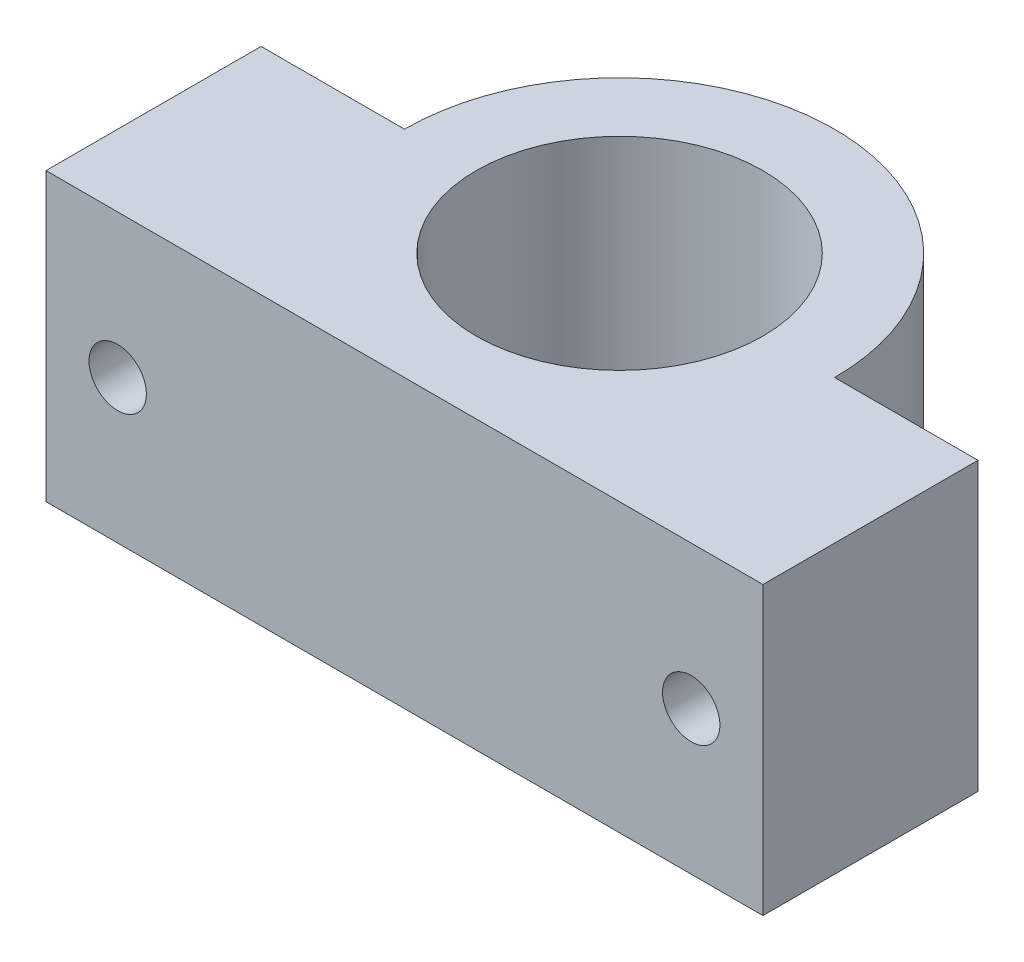
ISO-10303-21;
HEADER;
FILE_DESCRIPTION(('STEP AP214'),'2;1');
FILE_NAME('part.step','',(''),(''),'','','');
FILE_SCHEMA(('AUTOMOTIVE_DESIGN { 1 0 10303 214 1 1 1 1 }'));
ENDSEC;
DATA;
#1=APPLICATION_CONTEXT('core data for automotive mechanical design processes');
#2=APPLICATION_PROTOCOL_DEFINITION('international standard','automotive_design',2000,#1);
#3=PRODUCT_CONTEXT('',#1,'mechanical');
#4=PRODUCT('Part','Part','',(#3));
#5=PRODUCT_RELATED_PRODUCT_CATEGORY('part','',(#4));
#6=PRODUCT_DEFINITION_FORMATION('','',#4);
#7=PRODUCT_DEFINITION_CONTEXT('part definition',#1,'design');
#8=PRODUCT_DEFINITION('design','',#6,#7);
#9=PRODUCT_DEFINITION_SHAPE('','',#8);
#10=(LENGTH_UNIT() NAMED_UNIT(*) SI_UNIT(.MILLI.,.METRE.));
#11=(NAMED_UNIT(*) PLANE_ANGLE_UNIT() SI_UNIT($,.RADIAN.));
#12=(NAMED_UNIT(*) SI_UNIT($,.STERADIAN.) SOLID_ANGLE_UNIT());
#13=UNCERTAINTY_MEASURE_WITH_UNIT(LENGTH_MEASURE(1.E-05),#10,'distance_accuracy_value','');
#14=(GEOMETRIC_REPRESENTATION_CONTEXT(3) GLOBAL_UNCERTAINTY_ASSIGNED_CONTEXT((#13)) GLOBAL_UNIT_ASSIGNED_CONTEXT((#10,
#11,#12)) REPRESENTATION_CONTEXT('',''));
#15=CARTESIAN_POINT('',(0.,0.,0.));
#16=DIRECTION('',(0.,0.,1.));
#17=DIRECTION('',(1.,0.,0.));
#18=AXIS2_PLACEMENT_3D('',#15,#16,#17);
#19=CARTESIAN_POINT('',(-50.,20.,-15.));
#20=DIRECTION('',(1.,0.,0.));
#21=DIRECTION('',(0.,0.,-1.));
#22=AXIS2_PLACEMENT_3D('',#19,#20,#21);
#23=PLANE('',#22);
#24=DIRECTION('',(0.,0.,1.));
#25=VECTOR('',#24,1.);
#26=CARTESIAN_POINT('',(-50.,0.,-15.));
#27=LINE('',#26,#25);
#28=CARTESIAN_POINT('',(-50.,0.,-15.));
#29=VERTEX_POINT('',#28);
#30=CARTESIAN_POINT('',(-50.,0.,0.));
#31=VERTEX_POINT('',#30);
#32=EDGE_CURVE('E129',#29,#31,#27,.T.);
#33=ORIENTED_EDGE('',*,*,#32,.T.);
#34=DIRECTION('',(0.,-1.,0.));
#35=VECTOR('',#34,1.);
#36=CARTESIAN_POINT('',(-50.,20.,0.));
#37=LINE('',#36,#35);
#38=CARTESIAN_POINT('',(-50.,20.,0.));
#39=VERTEX_POINT('',#38);
#40=EDGE_CURVE('E11',#39,#31,#37,.T.);
#41=ORIENTED_EDGE('',*,*,#40,.F.);
#42=DIRECTION('',(0.,0.,1.));
#43=VECTOR('',#42,1.);
#44=CARTESIAN_POINT('',(-50.,20.,-15.));
#45=LINE('',#44,#43);
#46=CARTESIAN_POINT('',(-50.,20.,-15.));
#47=VERTEX_POINT('',#46);
#48=EDGE_CURVE('E140',#47,#39,#45,.T.);
#49=ORIENTED_EDGE('',*,*,#48,.F.);
#50=DIRECTION('',(0.,-1.,0.));
#51=VECTOR('',#50,1.);
#52=CARTESIAN_POINT('',(-50.,20.,-15.));
#53=LINE('',#52,#51);
#54=EDGE_CURVE('E125',#47,#29,#53,.T.);
#55=ORIENTED_EDGE('',*,*,#54,.T.);
#56=EDGE_LOOP('',(#33,#41,#49,#55));
#57=FACE_BOUND('',#56,.T.);
#58=ADVANCED_FACE('F45',(#57),#23,.F.);
#59=CARTESIAN_POINT('',(-50.,20.,0.));
#60=DIRECTION('',(0.,0.,-1.));
#61=DIRECTION('',(-1.,0.,0.));
#62=AXIS2_PLACEMENT_3D('',#59,#60,#61);
#63=PLANE('',#62);
#64=CARTESIAN_POINT('',(-45.,10.,0.));
#65=DIRECTION('',(0.,0.,-1.));
#66=DIRECTION('',(-1.,0.,0.));
#67=AXIS2_PLACEMENT_3D('',#64,#65,#66);
#68=CIRCLE('',#67,2.);
#69=CARTESIAN_POINT('',(-47.,10.,0.));
#70=VERTEX_POINT('',#69);
#71=EDGE_CURVE('E193',#70,#70,#68,.T.);
#72=ORIENTED_EDGE('',*,*,#71,.T.);
#73=EDGE_LOOP('',(#72));
#74=FACE_BOUND('',#73,.T.);
#75=CARTESIAN_POINT('',(-5.,10.,0.));
#76=DIRECTION('',(0.,0.,-1.));
#77=DIRECTION('',(-1.,0.,0.));
#78=AXIS2_PLACEMENT_3D('',#75,#76,#77);
#79=CIRCLE('',#78,2.);
#80=CARTESIAN_POINT('',(-7.,10.,0.));
#81=VERTEX_POINT('',#80);
#82=EDGE_CURVE('E190',#81,#81,#79,.T.);
#83=ORIENTED_EDGE('',*,*,#82,.T.);
#84=EDGE_LOOP('',(#83));
#85=FACE_BOUND('',#84,.T.);
#86=DIRECTION('',(1.,0.,0.));
#87=VECTOR('',#86,1.);
#88=CARTESIAN_POINT('',(-50.,0.,0.));
#89=LINE('',#88,#87);
#90=CARTESIAN_POINT('',(0.,0.,0.));
#91=VERTEX_POINT('',#90);
#92=EDGE_CURVE('E132',#31,#91,#89,.T.);
#93=ORIENTED_EDGE('',*,*,#92,.T.);
#94=DIRECTION('',(0.,-1.,0.));
#95=VECTOR('',#94,1.);
#96=CARTESIAN_POINT('',(0.,20.,0.));
#97=LINE('',#96,#95);
#98=CARTESIAN_POINT('',(0.,20.,0.));
#99=VERTEX_POINT('',#98);
#100=EDGE_CURVE('E53',#99,#91,#97,.T.);
#101=ORIENTED_EDGE('',*,*,#100,.F.);
#102=DIRECTION('',(1.,0.,0.));
#103=VECTOR('',#102,1.);
#104=CARTESIAN_POINT('',(-50.,20.,0.));
#105=LINE('',#104,#103);
#106=EDGE_CURVE('E98',#39,#99,#105,.T.);
#107=ORIENTED_EDGE('',*,*,#106,.F.);
#108=ORIENTED_EDGE('',*,*,#40,.T.);
#109=EDGE_LOOP('',(#93,#101,#107,#108));
#110=FACE_BOUND('',#109,.T.);
#111=ADVANCED_FACE('F169',(#74,#85,#110),#63,.F.);
#112=CARTESIAN_POINT('',(0.,20.,0.));
#113=DIRECTION('',(-1.,0.,0.));
#114=DIRECTION('',(0.,0.,1.));
#115=AXIS2_PLACEMENT_3D('',#112,#113,#114);
#116=PLANE('',#115);
#117=DIRECTION('',(0.,0.,-1.));
#118=VECTOR('',#117,1.);
#119=CARTESIAN_POINT('',(0.,0.,0.));
#120=LINE('',#119,#118);
#121=CARTESIAN_POINT('',(0.,0.,-15.));
#122=VERTEX_POINT('',#121);
#123=EDGE_CURVE('E135',#91,#122,#120,.T.);
#124=ORIENTED_EDGE('',*,*,#123,.T.);
#125=DIRECTION('',(0.,-1.,0.));
#126=VECTOR('',#125,1.);
#127=CARTESIAN_POINT('',(0.,20.,-15.));
#128=LINE('',#127,#126);
#129=CARTESIAN_POINT('',(0.,20.,-15.));
#130=VERTEX_POINT('',#129);
#131=EDGE_CURVE('E120',#130,#122,#128,.T.);
#132=ORIENTED_EDGE('',*,*,#131,.F.);
#133=DIRECTION('',(0.,0.,-1.));
#134=VECTOR('',#133,1.);
#135=CARTESIAN_POINT('',(0.,20.,0.));
#136=LINE('',#135,#134);
#137=EDGE_CURVE('E111',#99,#130,#136,.T.);
#138=ORIENTED_EDGE('',*,*,#137,.F.);
#139=ORIENTED_EDGE('',*,*,#100,.T.);
#140=EDGE_LOOP('',(#124,#132,#138,#139));
#141=FACE_BOUND('',#140,.T.);
#142=ADVANCED_FACE('F146',(#141),#116,.F.);
#143=CARTESIAN_POINT('',(0.,20.,-15.));
#144=DIRECTION('',(0.,0.,1.));
#145=DIRECTION('',(1.,0.,0.));
#146=AXIS2_PLACEMENT_3D('',#143,#144,#145);
#147=PLANE('',#146);
#148=CARTESIAN_POINT('',(-5.,10.,-15.));
#149=DIRECTION('',(0.,0.,-1.));
#150=DIRECTION('',(-1.,0.,0.));
#151=AXIS2_PLACEMENT_3D('',#148,#149,#150);
#152=CIRCLE('',#151,2.);
#153=CARTESIAN_POINT('',(-7.,10.,-15.));
#154=VERTEX_POINT('',#153);
#155=EDGE_CURVE('E187',#154,#154,#152,.T.);
#156=ORIENTED_EDGE('',*,*,#155,.F.);
#157=EDGE_LOOP('',(#156));
#158=FACE_BOUND('',#157,.T.);
#159=DIRECTION('',(-1.,0.,0.));
#160=VECTOR('',#159,1.);
#161=CARTESIAN_POINT('',(0.,0.,-15.));
#162=LINE('',#161,#160);
#163=CARTESIAN_POINT('',(-10.,0.,-15.));
#164=VERTEX_POINT('',#163);
#165=EDGE_CURVE('E119',#122,#164,#162,.T.);
#166=ORIENTED_EDGE('',*,*,#165,.T.);
#167=DIRECTION('',(0.,-1.,0.));
#168=VECTOR('',#167,1.);
#169=CARTESIAN_POINT('',(-10.,20.,-15.));
#170=LINE('',#169,#168);
#171=CARTESIAN_POINT('',(-10.,20.,-15.));
#172=VERTEX_POINT('',#171);
#173=EDGE_CURVE('E116',#172,#164,#170,.T.);
#174=ORIENTED_EDGE('',*,*,#173,.F.);
#175=DIRECTION('',(-1.,0.,0.));
#176=VECTOR('',#175,1.);
#177=CARTESIAN_POINT('',(0.,20.,-15.));
#178=LINE('',#177,#176);
#179=EDGE_CURVE('E105',#130,#172,#178,.T.);
#180=ORIENTED_EDGE('',*,*,#179,.F.);
#181=ORIENTED_EDGE('',*,*,#131,.T.);
#182=EDGE_LOOP('',(#166,#174,#180,#181));
#183=FACE_BOUND('',#182,.T.);
#184=ADVANCED_FACE('F117',(#158,#183),#147,.F.);
#185=CARTESIAN_POINT('',(-25.,20.,-15.));
#186=DIRECTION('',(0.,-1.,0.));
#187=DIRECTION('',(0.,0.,-1.));
#188=AXIS2_PLACEMENT_3D('',#185,#186,#187);
#189=CYLINDRICAL_SURFACE('',#188,15.);
#190=CARTESIAN_POINT('',(-25.,0.,-15.));
#191=DIRECTION('',(0.,1.,0.));
#192=DIRECTION('',(0.,0.,1.));
#193=AXIS2_PLACEMENT_3D('',#190,#191,#192);
#194=CIRCLE('',#193,15.);
#195=CARTESIAN_POINT('',(-40.,0.,-15.));
#196=VERTEX_POINT('',#195);
#197=EDGE_CURVE('E84',#164,#196,#194,.T.);
#198=ORIENTED_EDGE('',*,*,#197,.T.);
#199=DIRECTION('',(0.,-1.,0.));
#200=VECTOR('',#199,1.);
#201=CARTESIAN_POINT('',(-40.,20.,-15.));
#202=LINE('',#201,#200);
#203=CARTESIAN_POINT('',(-40.,20.,-15.));
#204=VERTEX_POINT('',#203);
#205=EDGE_CURVE('E121',#204,#196,#202,.T.);
#206=ORIENTED_EDGE('',*,*,#205,.F.);
#207=CARTESIAN_POINT('',(-25.,20.,-15.));
#208=DIRECTION('',(0.,1.,0.));
#209=DIRECTION('',(0.,0.,1.));
#210=AXIS2_PLACEMENT_3D('',#207,#208,#209);
#211=CIRCLE('',#210,15.);
#212=EDGE_CURVE('E109',#172,#204,#211,.T.);
#213=ORIENTED_EDGE('',*,*,#212,.F.);
#214=ORIENTED_EDGE('',*,*,#173,.T.);
#215=EDGE_LOOP('',(#198,#206,#213,#214));
#216=FACE_BOUND('',#215,.T.);
#217=ADVANCED_FACE('F123',(#216),#189,.T.);
#218=CARTESIAN_POINT('',(-40.,20.,-15.));
#219=DIRECTION('',(0.,0.,1.));
#220=DIRECTION('',(1.,0.,0.));
#221=AXIS2_PLACEMENT_3D('',#218,#219,#220);
#222=PLANE('',#221);
#223=CARTESIAN_POINT('',(-45.,10.,-15.));
#224=DIRECTION('',(0.,0.,-1.));
#225=DIRECTION('',(-1.,0.,0.));
#226=AXIS2_PLACEMENT_3D('',#223,#224,#225);
#227=CIRCLE('',#226,2.);
#228=CARTESIAN_POINT('',(-47.,10.,-15.));
#229=VERTEX_POINT('',#228);
#230=EDGE_CURVE('E189',#229,#229,#227,.T.);
#231=ORIENTED_EDGE('',*,*,#230,.F.);
#232=EDGE_LOOP('',(#231));
#233=FACE_BOUND('',#232,.T.);
#234=DIRECTION('',(-1.,0.,0.));
#235=VECTOR('',#234,1.);
#236=CARTESIAN_POINT('',(-40.,0.,-15.));
#237=LINE('',#236,#235);
#238=EDGE_CURVE('E90',#196,#29,#237,.T.);
#239=ORIENTED_EDGE('',*,*,#238,.T.);
#240=ORIENTED_EDGE('',*,*,#54,.F.);
#241=DIRECTION('',(-1.,0.,0.));
#242=VECTOR('',#241,1.);
#243=CARTESIAN_POINT('',(-40.,20.,-15.));
#244=LINE('',#243,#242);
#245=EDGE_CURVE('E61',#204,#47,#244,.T.);
#246=ORIENTED_EDGE('',*,*,#245,.F.);
#247=ORIENTED_EDGE('',*,*,#205,.T.);
#248=EDGE_LOOP('',(#239,#240,#246,#247));
#249=FACE_BOUND('',#248,.T.);
#250=ADVANCED_FACE('F153',(#233,#249),#222,.F.);
#251=CARTESIAN_POINT('',(-25.,20.,-15.));
#252=DIRECTION('',(0.,1.,0.));
#253=DIRECTION('',(0.,0.,1.));
#254=AXIS2_PLACEMENT_3D('',#251,#252,#253);
#255=PLANE('',#254);
#256=CARTESIAN_POINT('',(-25.,20.,-15.));
#257=DIRECTION('',(0.,-1.,0.));
#258=DIRECTION('',(0.,0.,-1.));
#259=AXIS2_PLACEMENT_3D('',#256,#257,#258);
#260=CIRCLE('',#259,10.);
#261=CARTESIAN_POINT('',(-25.,20.,-25.));
#262=VERTEX_POINT('',#261);
#263=EDGE_CURVE('E133',#262,#262,#260,.T.);
#264=ORIENTED_EDGE('',*,*,#263,.T.);
#265=EDGE_LOOP('',(#264));
#266=FACE_BOUND('',#265,.T.);
#267=ORIENTED_EDGE('',*,*,#48,.T.);
#268=ORIENTED_EDGE('',*,*,#106,.T.);
#269=ORIENTED_EDGE('',*,*,#137,.T.);
#270=ORIENTED_EDGE('',*,*,#179,.T.);
#271=ORIENTED_EDGE('',*,*,#212,.T.);
#272=ORIENTED_EDGE('',*,*,#245,.T.);
#273=EDGE_LOOP('',(#267,#268,#269,#270,#271,#272));
#274=FACE_BOUND('',#273,.T.);
#275=ADVANCED_FACE('F107',(#266,#274),#255,.T.);
#276=CARTESIAN_POINT('',(-25.,0.,-15.));
#277=DIRECTION('',(0.,1.,0.));
#278=DIRECTION('',(0.,0.,1.));
#279=AXIS2_PLACEMENT_3D('',#276,#277,#278);
#280=PLANE('',#279);
#281=CARTESIAN_POINT('',(-25.,0.,-15.));
#282=DIRECTION('',(0.,-1.,0.));
#283=DIRECTION('',(0.,0.,-1.));
#284=AXIS2_PLACEMENT_3D('',#281,#282,#283);
#285=CIRCLE('',#284,10.);
#286=CARTESIAN_POINT('',(-25.,0.,-25.));
#287=VERTEX_POINT('',#286);
#288=EDGE_CURVE('E201',#287,#287,#285,.T.);
#289=ORIENTED_EDGE('',*,*,#288,.F.);
#290=EDGE_LOOP('',(#289));
#291=FACE_BOUND('',#290,.T.);
#292=ORIENTED_EDGE('',*,*,#32,.F.);
#293=ORIENTED_EDGE('',*,*,#238,.F.);
#294=ORIENTED_EDGE('',*,*,#197,.F.);
#295=ORIENTED_EDGE('',*,*,#165,.F.);
#296=ORIENTED_EDGE('',*,*,#123,.F.);
#297=ORIENTED_EDGE('',*,*,#92,.F.);
#298=EDGE_LOOP('',(#292,#293,#294,#295,#296,#297));
#299=FACE_BOUND('',#298,.T.);
#300=ADVANCED_FACE('F149',(#291,#299),#280,.F.);
#301=CARTESIAN_POINT('',(-25.,20.,-15.));
#302=DIRECTION('',(0.,-1.,0.));
#303=DIRECTION('',(0.,0.,-1.));
#304=AXIS2_PLACEMENT_3D('',#301,#302,#303);
#305=CYLINDRICAL_SURFACE('',#304,10.);
#306=ORIENTED_EDGE('',*,*,#263,.F.);
#307=EDGE_LOOP('',(#306));
#308=FACE_BOUND('',#307,.T.);
#309=ORIENTED_EDGE('',*,*,#288,.T.);
#310=EDGE_LOOP('',(#309));
#311=FACE_BOUND('',#310,.T.);
#312=ADVANCED_FACE('F212',(#308,#311),#305,.F.);
#313=CARTESIAN_POINT('',(-45.,10.,0.));
#314=DIRECTION('',(0.,0.,-1.));
#315=DIRECTION('',(-1.,0.,0.));
#316=AXIS2_PLACEMENT_3D('',#313,#314,#315);
#317=CYLINDRICAL_SURFACE('',#316,2.);
#318=ORIENTED_EDGE('',*,*,#71,.F.);
#319=EDGE_LOOP('',(#318));
#320=FACE_BOUND('',#319,.T.);
#321=ORIENTED_EDGE('',*,*,#230,.T.);
#322=EDGE_LOOP('',(#321));
#323=FACE_BOUND('',#322,.T.);
#324=ADVANCED_FACE('F209',(#320,#323),#317,.F.);
#325=CARTESIAN_POINT('',(-5.,10.,0.));
#326=DIRECTION('',(0.,0.,-1.));
#327=DIRECTION('',(-1.,0.,0.));
#328=AXIS2_PLACEMENT_3D('',#325,#326,#327);
#329=CYLINDRICAL_SURFACE('',#328,2.);
#330=ORIENTED_EDGE('',*,*,#82,.F.);
#331=EDGE_LOOP('',(#330));
#332=FACE_BOUND('',#331,.T.);
#333=ORIENTED_EDGE('',*,*,#155,.T.);
#334=EDGE_LOOP('',(#333));
#335=FACE_BOUND('',#334,.T.);
#336=ADVANCED_FACE('F211',(#332,#335),#329,.F.);
#337=CLOSED_SHELL('',(#58,#111,#142,#184,#217,#250,#275,#300,#312,#324,#336));
#338=MANIFOLD_SOLID_BREP('B2',#337);
#339=ADVANCED_BREP_SHAPE_REPRESENTATION('',(#18,#338),#14);
#340=SHAPE_DEFINITION_REPRESENTATION(#9,#339);
ENDSEC;
END-ISO-10303-21;
